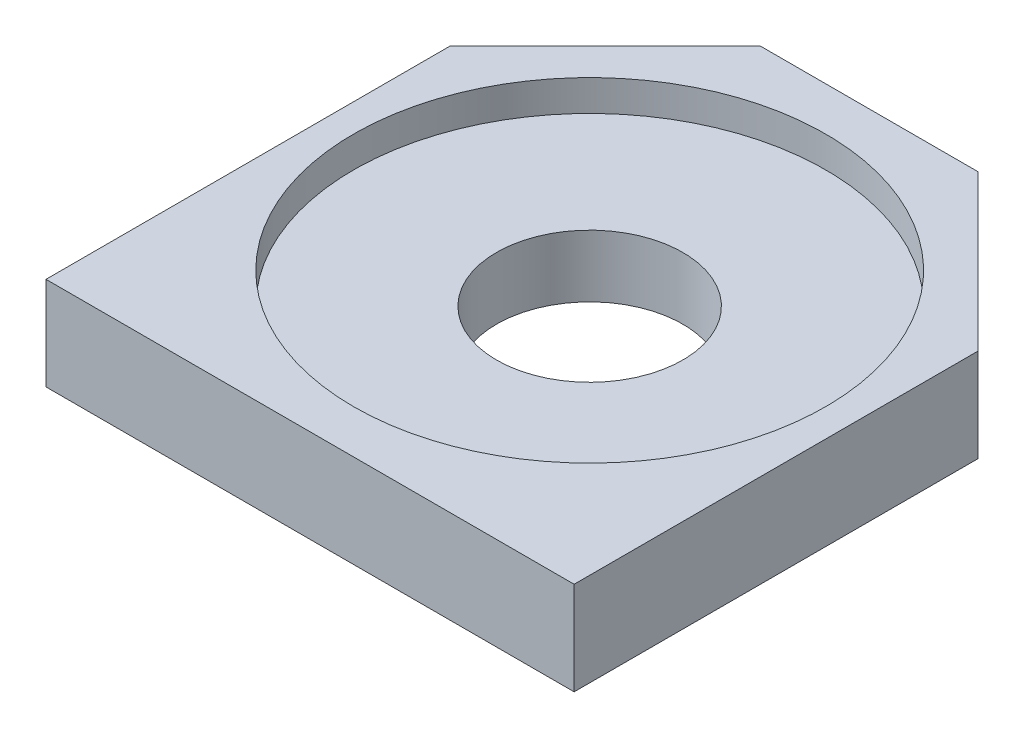
ISO-10303-21;
HEADER;
FILE_DESCRIPTION(('STEP AP214'),'2;1');
FILE_NAME('part.step','',(''),(''),'','','');
FILE_SCHEMA(('AUTOMOTIVE_DESIGN { 1 0 10303 214 1 1 1 1 }'));
ENDSEC;
DATA;
#1=APPLICATION_CONTEXT('core data for automotive mechanical design processes');
#2=APPLICATION_PROTOCOL_DEFINITION('international standard','automotive_design',2000,#1);
#3=PRODUCT_CONTEXT('',#1,'mechanical');
#4=PRODUCT('Part','Part','',(#3));
#5=PRODUCT_RELATED_PRODUCT_CATEGORY('part','',(#4));
#6=PRODUCT_DEFINITION_FORMATION('','',#4);
#7=PRODUCT_DEFINITION_CONTEXT('part definition',#1,'design');
#8=PRODUCT_DEFINITION('design','',#6,#7);
#9=PRODUCT_DEFINITION_SHAPE('','',#8);
#10=(LENGTH_UNIT() NAMED_UNIT(*) SI_UNIT(.MILLI.,.METRE.));
#11=(NAMED_UNIT(*) PLANE_ANGLE_UNIT() SI_UNIT($,.RADIAN.));
#12=(NAMED_UNIT(*) SI_UNIT($,.STERADIAN.) SOLID_ANGLE_UNIT());
#13=UNCERTAINTY_MEASURE_WITH_UNIT(LENGTH_MEASURE(1.E-05),#10,'distance_accuracy_value','');
#14=(GEOMETRIC_REPRESENTATION_CONTEXT(3) GLOBAL_UNCERTAINTY_ASSIGNED_CONTEXT((#13)) GLOBAL_UNIT_ASSIGNED_CONTEXT((#10,
#11,#12)) REPRESENTATION_CONTEXT('',''));
#15=CARTESIAN_POINT('',(0.,0.,0.));
#16=DIRECTION('',(0.,0.,1.));
#17=DIRECTION('',(1.,0.,0.));
#18=AXIS2_PLACEMENT_3D('',#15,#16,#17);
#19=CARTESIAN_POINT('',(85.,30.,90.));
#20=DIRECTION('',(-1.,0.,0.));
#21=DIRECTION('',(0.,0.,1.));
#22=AXIS2_PLACEMENT_3D('',#19,#20,#21);
#23=PLANE('',#22);
#24=DIRECTION('',(0.,0.,-1.));
#25=VECTOR('',#24,1.);
#26=CARTESIAN_POINT('',(85.,0.,90.));
#27=LINE('',#26,#25);
#28=CARTESIAN_POINT('',(85.,0.,90.));
#29=VERTEX_POINT('',#28);
#30=CARTESIAN_POINT('',(85.,0.,-39.9999999999998));
#31=VERTEX_POINT('',#30);
#32=EDGE_CURVE('E168',#29,#31,#27,.T.);
#33=ORIENTED_EDGE('',*,*,#32,.T.);
#34=DIRECTION('',(0.,1.,0.));
#35=VECTOR('',#34,1.);
#36=CARTESIAN_POINT('',(85.,30.,-39.9999999999999));
#37=LINE('',#36,#35);
#38=CARTESIAN_POINT('',(85.,30.,-39.9999999999998));
#39=VERTEX_POINT('',#38);
#40=EDGE_CURVE('E204',#31,#39,#37,.T.);
#41=ORIENTED_EDGE('',*,*,#40,.T.);
#42=DIRECTION('',(0.,0.,-1.));
#43=VECTOR('',#42,1.);
#44=CARTESIAN_POINT('',(85.,30.,90.));
#45=LINE('',#44,#43);
#46=CARTESIAN_POINT('',(85.,30.,90.));
#47=VERTEX_POINT('',#46);
#48=EDGE_CURVE('E171',#47,#39,#45,.T.);
#49=ORIENTED_EDGE('',*,*,#48,.F.);
#50=DIRECTION('',(0.,-1.,0.));
#51=VECTOR('',#50,1.);
#52=CARTESIAN_POINT('',(85.,30.,90.));
#53=LINE('',#52,#51);
#54=EDGE_CURVE('E181',#47,#29,#53,.T.);
#55=ORIENTED_EDGE('',*,*,#54,.T.);
#56=EDGE_LOOP('',(#33,#41,#49,#55));
#57=FACE_BOUND('',#56,.T.);
#58=ADVANCED_FACE('F41',(#57),#23,.F.);
#59=CARTESIAN_POINT('',(-85.,30.,-90.));
#60=DIRECTION('',(0.,0.,1.));
#61=DIRECTION('',(1.,0.,0.));
#62=AXIS2_PLACEMENT_3D('',#59,#60,#61);
#63=PLANE('',#62);
#64=DIRECTION('',(1.,0.,0.));
#65=VECTOR('',#64,1.);
#66=CARTESIAN_POINT('',(20.,20.,-90.));
#67=LINE('',#66,#65);
#68=CARTESIAN_POINT('',(-20.,20.,-90.));
#69=VERTEX_POINT('',#68);
#70=CARTESIAN_POINT('',(20.,20.,-90.));
#71=VERTEX_POINT('',#70);
#72=EDGE_CURVE('E149',#69,#71,#67,.T.);
#73=ORIENTED_EDGE('',*,*,#72,.F.);
#74=DIRECTION('',(0.,1.,0.));
#75=VECTOR('',#74,1.);
#76=CARTESIAN_POINT('',(-20.,20.,-90.));
#77=LINE('',#76,#75);
#78=CARTESIAN_POINT('',(-20.,5.,-90.));
#79=VERTEX_POINT('',#78);
#80=EDGE_CURVE('E57',#79,#69,#77,.T.);
#81=ORIENTED_EDGE('',*,*,#80,.F.);
#82=DIRECTION('',(-1.,0.,0.));
#83=VECTOR('',#82,1.);
#84=CARTESIAN_POINT('',(20.,5.,-90.));
#85=LINE('',#84,#83);
#86=CARTESIAN_POINT('',(20.,5.,-90.));
#87=VERTEX_POINT('',#86);
#88=EDGE_CURVE('E140',#87,#79,#85,.T.);
#89=ORIENTED_EDGE('',*,*,#88,.F.);
#90=DIRECTION('',(0.,-1.,0.));
#91=VECTOR('',#90,1.);
#92=CARTESIAN_POINT('',(20.,20.,-90.));
#93=LINE('',#92,#91);
#94=EDGE_CURVE('E143',#71,#87,#93,.T.);
#95=ORIENTED_EDGE('',*,*,#94,.F.);
#96=EDGE_LOOP('',(#73,#81,#89,#95));
#97=FACE_BOUND('',#96,.T.);
#98=DIRECTION('',(-1.,0.,0.));
#99=VECTOR('',#98,1.);
#100=CARTESIAN_POINT('',(-85.,30.,-90.));
#101=LINE('',#100,#99);
#102=CARTESIAN_POINT('',(35.0000000000001,30.,-90.));
#103=VERTEX_POINT('',#102);
#104=CARTESIAN_POINT('',(-34.9999999999999,30.,-90.));
#105=VERTEX_POINT('',#104);
#106=EDGE_CURVE('E174',#103,#105,#101,.T.);
#107=ORIENTED_EDGE('',*,*,#106,.F.);
#108=DIRECTION('',(0.,-1.,0.));
#109=VECTOR('',#108,1.);
#110=CARTESIAN_POINT('',(35.0000000000001,30.,-90.));
#111=LINE('',#110,#109);
#112=CARTESIAN_POINT('',(35.0000000000001,0.,-90.));
#113=VERTEX_POINT('',#112);
#114=EDGE_CURVE('E197',#103,#113,#111,.T.);
#115=ORIENTED_EDGE('',*,*,#114,.T.);
#116=DIRECTION('',(-1.,0.,0.));
#117=VECTOR('',#116,1.);
#118=CARTESIAN_POINT('',(-85.,0.,-90.));
#119=LINE('',#118,#117);
#120=CARTESIAN_POINT('',(-34.9999999999999,0.,-90.));
#121=VERTEX_POINT('',#120);
#122=EDGE_CURVE('E184',#113,#121,#119,.T.);
#123=ORIENTED_EDGE('',*,*,#122,.T.);
#124=DIRECTION('',(0.,1.,0.));
#125=VECTOR('',#124,1.);
#126=CARTESIAN_POINT('',(-34.9999999999999,30.,-90.));
#127=LINE('',#126,#125);
#128=EDGE_CURVE('E195',#121,#105,#127,.T.);
#129=ORIENTED_EDGE('',*,*,#128,.T.);
#130=EDGE_LOOP('',(#107,#115,#123,#129));
#131=FACE_BOUND('',#130,.T.);
#132=ADVANCED_FACE('F214',(#97,#131),#63,.F.);
#133=CARTESIAN_POINT('',(-85.,30.,90.));
#134=DIRECTION('',(1.,0.,0.));
#135=DIRECTION('',(0.,0.,-1.));
#136=AXIS2_PLACEMENT_3D('',#133,#134,#135);
#137=PLANE('',#136);
#138=DIRECTION('',(0.,0.,1.));
#139=VECTOR('',#138,1.);
#140=CARTESIAN_POINT('',(-85.,30.,90.));
#141=LINE('',#140,#139);
#142=CARTESIAN_POINT('',(-85.,30.,-40.));
#143=VERTEX_POINT('',#142);
#144=CARTESIAN_POINT('',(-85.,30.,90.));
#145=VERTEX_POINT('',#144);
#146=EDGE_CURVE('E177',#143,#145,#141,.T.);
#147=ORIENTED_EDGE('',*,*,#146,.F.);
#148=DIRECTION('',(0.,-1.,0.));
#149=VECTOR('',#148,1.);
#150=CARTESIAN_POINT('',(-85.,30.,-40.));
#151=LINE('',#150,#149);
#152=CARTESIAN_POINT('',(-85.,0.,-40.));
#153=VERTEX_POINT('',#152);
#154=EDGE_CURVE('E11',#143,#153,#151,.T.);
#155=ORIENTED_EDGE('',*,*,#154,.T.);
#156=DIRECTION('',(0.,0.,1.));
#157=VECTOR('',#156,1.);
#158=CARTESIAN_POINT('',(-85.,0.,90.));
#159=LINE('',#158,#157);
#160=CARTESIAN_POINT('',(-85.,0.,90.));
#161=VERTEX_POINT('',#160);
#162=EDGE_CURVE('E187',#153,#161,#159,.T.);
#163=ORIENTED_EDGE('',*,*,#162,.T.);
#164=DIRECTION('',(0.,-1.,0.));
#165=VECTOR('',#164,1.);
#166=CARTESIAN_POINT('',(-85.,30.,90.));
#167=LINE('',#166,#165);
#168=EDGE_CURVE('E192',#145,#161,#167,.T.);
#169=ORIENTED_EDGE('',*,*,#168,.F.);
#170=EDGE_LOOP('',(#147,#155,#163,#169));
#171=FACE_BOUND('',#170,.T.);
#172=ADVANCED_FACE('F230',(#171),#137,.F.);
#173=CARTESIAN_POINT('',(-85.,30.,90.));
#174=DIRECTION('',(0.,0.,-1.));
#175=DIRECTION('',(-1.,0.,0.));
#176=AXIS2_PLACEMENT_3D('',#173,#174,#175);
#177=PLANE('',#176);
#178=DIRECTION('',(1.,0.,0.));
#179=VECTOR('',#178,1.);
#180=CARTESIAN_POINT('',(-85.,0.,90.));
#181=LINE('',#180,#179);
#182=EDGE_CURVE('E175',#161,#29,#181,.T.);
#183=ORIENTED_EDGE('',*,*,#182,.T.);
#184=ORIENTED_EDGE('',*,*,#54,.F.);
#185=DIRECTION('',(1.,0.,0.));
#186=VECTOR('',#185,1.);
#187=CARTESIAN_POINT('',(-85.,30.,90.));
#188=LINE('',#187,#186);
#189=EDGE_CURVE('E179',#145,#47,#188,.T.);
#190=ORIENTED_EDGE('',*,*,#189,.F.);
#191=ORIENTED_EDGE('',*,*,#168,.T.);
#192=EDGE_LOOP('',(#183,#184,#190,#191));
#193=FACE_BOUND('',#192,.T.);
#194=ADVANCED_FACE('F226',(#193),#177,.F.);
#195=CARTESIAN_POINT('',(0.,30.,0.));
#196=DIRECTION('',(0.,-1.,0.));
#197=DIRECTION('',(0.,0.,-1.));
#198=AXIS2_PLACEMENT_3D('',#195,#196,#197);
#199=PLANE('',#198);
#200=CARTESIAN_POINT('',(0.,30.,0.));
#201=DIRECTION('',(0.,1.,0.));
#202=DIRECTION('',(0.,0.,1.));
#203=AXIS2_PLACEMENT_3D('',#200,#201,#202);
#204=CIRCLE('',#203,76.);
#205=CARTESIAN_POINT('',(0.,30.,76.));
#206=VERTEX_POINT('',#205);
#207=EDGE_CURVE('E162',#206,#206,#204,.T.);
#208=ORIENTED_EDGE('',*,*,#207,.F.);
#209=EDGE_LOOP('',(#208));
#210=FACE_BOUND('',#209,.T.);
#211=ORIENTED_EDGE('',*,*,#48,.T.);
#212=DIRECTION('',(0.707106781186546,0.,0.707106781186549));
#213=VECTOR('',#212,1.);
#214=CARTESIAN_POINT('',(35.0000000000001,30.,-90.));
#215=LINE('',#214,#213);
#216=EDGE_CURVE('E50',#39,#103,#215,.F.);
#217=ORIENTED_EDGE('',*,*,#216,.T.);
#218=ORIENTED_EDGE('',*,*,#106,.T.);
#219=DIRECTION('',(0.707106781186549,0.,-0.707106781186546));
#220=VECTOR('',#219,1.);
#221=CARTESIAN_POINT('',(-85.,30.,-40.));
#222=LINE('',#221,#220);
#223=EDGE_CURVE('E65',#105,#143,#222,.F.);
#224=ORIENTED_EDGE('',*,*,#223,.T.);
#225=ORIENTED_EDGE('',*,*,#146,.T.);
#226=ORIENTED_EDGE('',*,*,#189,.T.);
#227=EDGE_LOOP('',(#211,#217,#218,#224,#225,#226));
#228=FACE_BOUND('',#227,.T.);
#229=ADVANCED_FACE('F208',(#210,#228),#199,.F.);
#230=CARTESIAN_POINT('',(0.,0.,0.));
#231=DIRECTION('',(0.,-1.,0.));
#232=DIRECTION('',(0.,0.,-1.));
#233=AXIS2_PLACEMENT_3D('',#230,#231,#232);
#234=PLANE('',#233);
#235=CARTESIAN_POINT('',(0.,0.,0.));
#236=DIRECTION('',(0.,1.,0.));
#237=DIRECTION('',(0.,0.,1.));
#238=AXIS2_PLACEMENT_3D('',#235,#236,#237);
#239=CIRCLE('',#238,30.);
#240=CARTESIAN_POINT('',(0.,0.,30.));
#241=VERTEX_POINT('',#240);
#242=EDGE_CURVE('E159',#241,#241,#239,.T.);
#243=ORIENTED_EDGE('',*,*,#242,.T.);
#244=EDGE_LOOP('',(#243));
#245=FACE_BOUND('',#244,.T.);
#246=ORIENTED_EDGE('',*,*,#122,.F.);
#247=DIRECTION('',(-0.707106781186546,0.,-0.707106781186549));
#248=VECTOR('',#247,1.);
#249=CARTESIAN_POINT('',(62.5000000000001,0.,-62.4999999999999));
#250=LINE('',#249,#248);
#251=EDGE_CURVE('E202',#113,#31,#250,.F.);
#252=ORIENTED_EDGE('',*,*,#251,.T.);
#253=ORIENTED_EDGE('',*,*,#32,.F.);
#254=ORIENTED_EDGE('',*,*,#182,.F.);
#255=ORIENTED_EDGE('',*,*,#162,.F.);
#256=DIRECTION('',(-0.707106781186549,0.,0.707106781186546));
#257=VECTOR('',#256,1.);
#258=CARTESIAN_POINT('',(-62.4999999999999,0.,-62.5000000000001));
#259=LINE('',#258,#257);
#260=EDGE_CURVE('E200',#153,#121,#259,.F.);
#261=ORIENTED_EDGE('',*,*,#260,.T.);
#262=EDGE_LOOP('',(#246,#252,#253,#254,#255,#261));
#263=FACE_BOUND('',#262,.T.);
#264=ADVANCED_FACE('F220',(#245,#263),#234,.T.);
#265=CARTESIAN_POINT('',(35.0000000000001,30.,-90.));
#266=DIRECTION('',(-0.707106781186549,0.,0.707106781186546));
#267=DIRECTION('',(0.,-1.,0.));
#268=AXIS2_PLACEMENT_3D('',#265,#266,#267);
#269=PLANE('',#268);
#270=ORIENTED_EDGE('',*,*,#216,.F.);
#271=ORIENTED_EDGE('',*,*,#40,.F.);
#272=ORIENTED_EDGE('',*,*,#251,.F.);
#273=ORIENTED_EDGE('',*,*,#114,.F.);
#274=EDGE_LOOP('',(#270,#271,#272,#273));
#275=FACE_BOUND('',#274,.T.);
#276=ADVANCED_FACE('F217',(#275),#269,.F.);
#277=CARTESIAN_POINT('',(-85.,30.,-40.));
#278=DIRECTION('',(0.707106781186546,0.,0.707106781186549));
#279=DIRECTION('',(0.,-1.,0.));
#280=AXIS2_PLACEMENT_3D('',#277,#278,#279);
#281=PLANE('',#280);
#282=ORIENTED_EDGE('',*,*,#223,.F.);
#283=ORIENTED_EDGE('',*,*,#128,.F.);
#284=ORIENTED_EDGE('',*,*,#260,.F.);
#285=ORIENTED_EDGE('',*,*,#154,.F.);
#286=EDGE_LOOP('',(#282,#283,#284,#285));
#287=FACE_BOUND('',#286,.T.);
#288=ADVANCED_FACE('F44',(#287),#281,.F.);
#289=CARTESIAN_POINT('',(0.,20.,0.));
#290=DIRECTION('',(0.,1.,0.));
#291=DIRECTION('',(0.,0.,1.));
#292=AXIS2_PLACEMENT_3D('',#289,#290,#291);
#293=CYLINDRICAL_SURFACE('',#292,76.);
#294=CARTESIAN_POINT('',(0.,20.,0.));
#295=DIRECTION('',(0.,1.,0.));
#296=DIRECTION('',(0.,0.,1.));
#297=AXIS2_PLACEMENT_3D('',#294,#295,#296);
#298=CIRCLE('',#297,76.);
#299=CARTESIAN_POINT('',(0.,20.,76.));
#300=VERTEX_POINT('',#299);
#301=EDGE_CURVE('E165',#300,#300,#298,.T.);
#302=ORIENTED_EDGE('',*,*,#301,.F.);
#303=EDGE_LOOP('',(#302));
#304=FACE_BOUND('',#303,.T.);
#305=ORIENTED_EDGE('',*,*,#207,.T.);
#306=EDGE_LOOP('',(#305));
#307=FACE_BOUND('',#306,.T.);
#308=ADVANCED_FACE('F234',(#304,#307),#293,.F.);
#309=CARTESIAN_POINT('',(0.,20.,0.));
#310=DIRECTION('',(0.,1.,0.));
#311=DIRECTION('',(0.,0.,1.));
#312=AXIS2_PLACEMENT_3D('',#309,#310,#311);
#313=PLANE('',#312);
#314=CARTESIAN_POINT('',(0.,20.,0.));
#315=DIRECTION('',(0.,1.,0.));
#316=DIRECTION('',(0.,0.,1.));
#317=AXIS2_PLACEMENT_3D('',#314,#315,#316);
#318=CIRCLE('',#317,30.);
#319=CARTESIAN_POINT('',(0.,20.,30.));
#320=VERTEX_POINT('',#319);
#321=EDGE_CURVE('E155',#320,#320,#318,.T.);
#322=ORIENTED_EDGE('',*,*,#321,.F.);
#323=EDGE_LOOP('',(#322));
#324=FACE_BOUND('',#323,.T.);
#325=ORIENTED_EDGE('',*,*,#301,.T.);
#326=EDGE_LOOP('',(#325));
#327=FACE_BOUND('',#326,.T.);
#328=ADVANCED_FACE('F239',(#324,#327),#313,.T.);
#329=CARTESIAN_POINT('',(0.,0.,0.));
#330=DIRECTION('',(0.,1.,0.));
#331=DIRECTION('',(0.,0.,1.));
#332=AXIS2_PLACEMENT_3D('',#329,#330,#331);
#333=CYLINDRICAL_SURFACE('',#332,30.);
#334=ORIENTED_EDGE('',*,*,#242,.F.);
#335=EDGE_LOOP('',(#334));
#336=FACE_BOUND('',#335,.T.);
#337=ORIENTED_EDGE('',*,*,#321,.T.);
#338=EDGE_LOOP('',(#337));
#339=FACE_BOUND('',#338,.T.);
#340=ADVANCED_FACE('F267',(#336,#339),#333,.F.);
#341=CARTESIAN_POINT('',(-20.,20.,-80.));
#342=DIRECTION('',(-1.,0.,0.));
#343=DIRECTION('',(0.,-1.,0.));
#344=AXIS2_PLACEMENT_3D('',#341,#342,#343);
#345=PLANE('',#344);
#346=ORIENTED_EDGE('',*,*,#80,.T.);
#347=DIRECTION('',(0.,0.,-1.));
#348=VECTOR('',#347,1.);
#349=CARTESIAN_POINT('',(-20.,20.,-80.));
#350=LINE('',#349,#348);
#351=CARTESIAN_POINT('',(-20.,20.,-80.));
#352=VERTEX_POINT('',#351);
#353=EDGE_CURVE('E118',#352,#69,#350,.T.);
#354=ORIENTED_EDGE('',*,*,#353,.F.);
#355=DIRECTION('',(0.,1.,0.));
#356=VECTOR('',#355,1.);
#357=CARTESIAN_POINT('',(-20.,20.,-80.));
#358=LINE('',#357,#356);
#359=CARTESIAN_POINT('',(-20.,5.,-80.));
#360=VERTEX_POINT('',#359);
#361=EDGE_CURVE('E122',#360,#352,#358,.T.);
#362=ORIENTED_EDGE('',*,*,#361,.F.);
#363=DIRECTION('',(0.,0.,-1.));
#364=VECTOR('',#363,1.);
#365=CARTESIAN_POINT('',(-20.,5.,-80.));
#366=LINE('',#365,#364);
#367=EDGE_CURVE('E153',#360,#79,#366,.T.);
#368=ORIENTED_EDGE('',*,*,#367,.T.);
#369=EDGE_LOOP('',(#346,#354,#362,#368));
#370=FACE_BOUND('',#369,.T.);
#371=ADVANCED_FACE('F120',(#370),#345,.F.);
#372=CARTESIAN_POINT('',(20.,5.,-80.));
#373=DIRECTION('',(0.,-1.,0.));
#374=DIRECTION('',(0.,0.,-1.));
#375=AXIS2_PLACEMENT_3D('',#372,#373,#374);
#376=PLANE('',#375);
#377=ORIENTED_EDGE('',*,*,#88,.T.);
#378=ORIENTED_EDGE('',*,*,#367,.F.);
#379=DIRECTION('',(-1.,0.,0.));
#380=VECTOR('',#379,1.);
#381=CARTESIAN_POINT('',(20.,5.,-80.));
#382=LINE('',#381,#380);
#383=CARTESIAN_POINT('',(20.,5.,-80.));
#384=VERTEX_POINT('',#383);
#385=EDGE_CURVE('E128',#384,#360,#382,.T.);
#386=ORIENTED_EDGE('',*,*,#385,.F.);
#387=DIRECTION('',(0.,0.,-1.));
#388=VECTOR('',#387,1.);
#389=CARTESIAN_POINT('',(20.,5.,-80.));
#390=LINE('',#389,#388);
#391=EDGE_CURVE('E156',#384,#87,#390,.T.);
#392=ORIENTED_EDGE('',*,*,#391,.T.);
#393=EDGE_LOOP('',(#377,#378,#386,#392));
#394=FACE_BOUND('',#393,.T.);
#395=ADVANCED_FACE('F274',(#394),#376,.F.);
#396=CARTESIAN_POINT('',(20.,20.,-80.));
#397=DIRECTION('',(1.,0.,0.));
#398=DIRECTION('',(0.,1.,0.));
#399=AXIS2_PLACEMENT_3D('',#396,#397,#398);
#400=PLANE('',#399);
#401=ORIENTED_EDGE('',*,*,#94,.T.);
#402=ORIENTED_EDGE('',*,*,#391,.F.);
#403=DIRECTION('',(0.,-1.,0.));
#404=VECTOR('',#403,1.);
#405=CARTESIAN_POINT('',(20.,20.,-80.));
#406=LINE('',#405,#404);
#407=CARTESIAN_POINT('',(20.,20.,-80.));
#408=VERTEX_POINT('',#407);
#409=EDGE_CURVE('E136',#408,#384,#406,.T.);
#410=ORIENTED_EDGE('',*,*,#409,.F.);
#411=DIRECTION('',(0.,0.,-1.));
#412=VECTOR('',#411,1.);
#413=CARTESIAN_POINT('',(20.,20.,-80.));
#414=LINE('',#413,#412);
#415=EDGE_CURVE('E127',#408,#71,#414,.T.);
#416=ORIENTED_EDGE('',*,*,#415,.T.);
#417=EDGE_LOOP('',(#401,#402,#410,#416));
#418=FACE_BOUND('',#417,.T.);
#419=ADVANCED_FACE('F277',(#418),#400,.F.);
#420=CARTESIAN_POINT('',(20.,20.,-80.));
#421=DIRECTION('',(0.,1.,0.));
#422=DIRECTION('',(-1.,0.,0.));
#423=AXIS2_PLACEMENT_3D('',#420,#421,#422);
#424=PLANE('',#423);
#425=ORIENTED_EDGE('',*,*,#72,.T.);
#426=ORIENTED_EDGE('',*,*,#415,.F.);
#427=DIRECTION('',(1.,0.,0.));
#428=VECTOR('',#427,1.);
#429=CARTESIAN_POINT('',(20.,20.,-80.));
#430=LINE('',#429,#428);
#431=EDGE_CURVE('E131',#352,#408,#430,.T.);
#432=ORIENTED_EDGE('',*,*,#431,.F.);
#433=ORIENTED_EDGE('',*,*,#353,.T.);
#434=EDGE_LOOP('',(#425,#426,#432,#433));
#435=FACE_BOUND('',#434,.T.);
#436=ADVANCED_FACE('F132',(#435),#424,.F.);
#437=CARTESIAN_POINT('',(0.,0.,-80.));
#438=DIRECTION('',(0.,0.,-1.));
#439=DIRECTION('',(-1.,0.,0.));
#440=AXIS2_PLACEMENT_3D('',#437,#438,#439);
#441=PLANE('',#440);
#442=ORIENTED_EDGE('',*,*,#361,.T.);
#443=ORIENTED_EDGE('',*,*,#431,.T.);
#444=ORIENTED_EDGE('',*,*,#409,.T.);
#445=ORIENTED_EDGE('',*,*,#385,.T.);
#446=EDGE_LOOP('',(#442,#443,#444,#445));
#447=FACE_BOUND('',#446,.T.);
#448=ADVANCED_FACE('F138',(#447),#441,.T.);
#449=CLOSED_SHELL('',(#58,#132,#172,#194,#229,#264,#276,#288,#308,#328,#340,#371,#395,#419,#436,#448));
#450=MANIFOLD_SOLID_BREP('B2',#449);
#451=ADVANCED_BREP_SHAPE_REPRESENTATION('',(#18,#450),#14);
#452=SHAPE_DEFINITION_REPRESENTATION(#9,#451);
ENDSEC;
END-ISO-10303-21;
